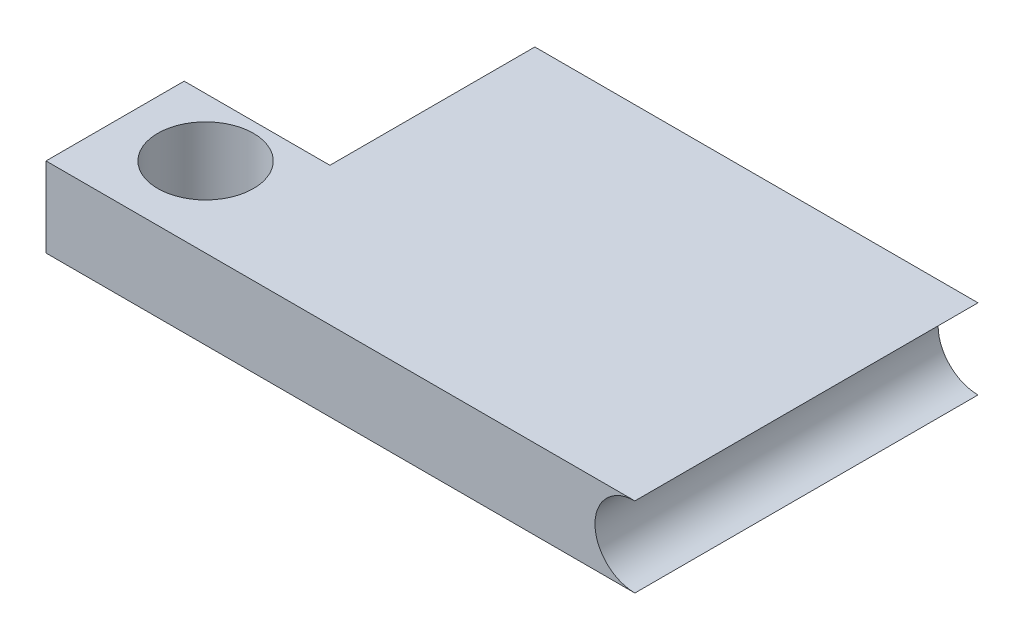
ISO-10303-21;
HEADER;
FILE_DESCRIPTION(('STEP AP214'),'2;1');
FILE_NAME('part.step','',(''),(''),'','','');
FILE_SCHEMA(('AUTOMOTIVE_DESIGN { 1 0 10303 214 1 1 1 1 }'));
ENDSEC;
DATA;
#1=APPLICATION_CONTEXT('core data for automotive mechanical design processes');
#2=APPLICATION_PROTOCOL_DEFINITION('international standard','automotive_design',2000,#1);
#3=PRODUCT_CONTEXT('',#1,'mechanical');
#4=PRODUCT('Part','Part','',(#3));
#5=PRODUCT_RELATED_PRODUCT_CATEGORY('part','',(#4));
#6=PRODUCT_DEFINITION_FORMATION('','',#4);
#7=PRODUCT_DEFINITION_CONTEXT('part definition',#1,'design');
#8=PRODUCT_DEFINITION('design','',#6,#7);
#9=PRODUCT_DEFINITION_SHAPE('','',#8);
#10=(LENGTH_UNIT() NAMED_UNIT(*) SI_UNIT(.MILLI.,.METRE.));
#11=(NAMED_UNIT(*) PLANE_ANGLE_UNIT() SI_UNIT($,.RADIAN.));
#12=(NAMED_UNIT(*) SI_UNIT($,.STERADIAN.) SOLID_ANGLE_UNIT());
#13=UNCERTAINTY_MEASURE_WITH_UNIT(LENGTH_MEASURE(1.E-05),#10,'distance_accuracy_value','');
#14=(GEOMETRIC_REPRESENTATION_CONTEXT(3) GLOBAL_UNCERTAINTY_ASSIGNED_CONTEXT((#13)) GLOBAL_UNIT_ASSIGNED_CONTEXT((#10,
#11,#12)) REPRESENTATION_CONTEXT('',''));
#15=CARTESIAN_POINT('',(0.,0.,0.));
#16=DIRECTION('',(0.,0.,1.));
#17=DIRECTION('',(1.,0.,0.));
#18=AXIS2_PLACEMENT_3D('',#15,#16,#17);
#19=CARTESIAN_POINT('',(0.,150.,644.999999999999));
#20=DIRECTION('',(1.,0.,0.));
#21=DIRECTION('',(0.,0.,-1.));
#22=AXIS2_PLACEMENT_3D('',#19,#20,#21);
#23=PLANE('',#22);
#24=DIRECTION('',(0.,0.,-1.));
#25=VECTOR('',#24,1.);
#26=CARTESIAN_POINT('',(0.,150.,644.999999999999));
#27=LINE('',#26,#25);
#28=CARTESIAN_POINT('',(0.,150.,644.999999999999));
#29=VERTEX_POINT('',#28);
#30=CARTESIAN_POINT('',(0.,150.,385.258703224895));
#31=VERTEX_POINT('',#30);
#32=EDGE_CURVE('E65',#29,#31,#27,.T.);
#33=ORIENTED_EDGE('',*,*,#32,.T.);
#34=DIRECTION('',(0.,-1.,0.));
#35=VECTOR('',#34,1.);
#36=CARTESIAN_POINT('',(0.,150.,385.258703224895));
#37=LINE('',#36,#35);
#38=CARTESIAN_POINT('',(0.,0.,385.258703224895));
#39=VERTEX_POINT('',#38);
#40=EDGE_CURVE('E85',#31,#39,#37,.T.);
#41=ORIENTED_EDGE('',*,*,#40,.T.);
#42=DIRECTION('',(0.,0.,-1.));
#43=VECTOR('',#42,1.);
#44=CARTESIAN_POINT('',(0.,0.,644.999999999999));
#45=LINE('',#44,#43);
#46=CARTESIAN_POINT('',(0.,0.,644.999999999999));
#47=VERTEX_POINT('',#46);
#48=EDGE_CURVE('E11',#47,#39,#45,.T.);
#49=ORIENTED_EDGE('',*,*,#48,.F.);
#50=DIRECTION('',(0.,-1.,0.));
#51=VECTOR('',#50,1.);
#52=CARTESIAN_POINT('',(0.,150.,644.999999999999));
#53=LINE('',#52,#51);
#54=EDGE_CURVE('E117',#29,#47,#53,.T.);
#55=ORIENTED_EDGE('',*,*,#54,.F.);
#56=EDGE_LOOP('',(#33,#41,#49,#55));
#57=FACE_BOUND('',#56,.T.);
#58=ADVANCED_FACE('F42',(#57),#23,.F.);
#59=CARTESIAN_POINT('',(0.,0.,644.999999999999));
#60=DIRECTION('',(0.,1.,0.));
#61=DIRECTION('',(0.,0.,1.));
#62=AXIS2_PLACEMENT_3D('',#59,#60,#61);
#63=PLANE('',#62);
#64=CARTESIAN_POINT('',(150.,0.,494.999999999999));
#65=DIRECTION('',(0.,-1.,0.));
#66=DIRECTION('',(0.,0.,-1.));
#67=AXIS2_PLACEMENT_3D('',#64,#65,#66);
#68=CIRCLE('',#67,90.);
#69=CARTESIAN_POINT('',(150.,0.,404.999999999999));
#70=VERTEX_POINT('',#69);
#71=EDGE_CURVE('E106',#70,#70,#68,.T.);
#72=ORIENTED_EDGE('',*,*,#71,.F.);
#73=EDGE_LOOP('',(#72));
#74=FACE_BOUND('',#73,.T.);
#75=ORIENTED_EDGE('',*,*,#48,.T.);
#76=DIRECTION('',(-1.,0.,0.));
#77=VECTOR('',#76,1.);
#78=CARTESIAN_POINT('',(0.,0.,385.258703224895));
#79=LINE('',#78,#77);
#80=CARTESIAN_POINT('',(273.936328983051,0.,385.258703224895));
#81=VERTEX_POINT('',#80);
#82=EDGE_CURVE('E96',#81,#39,#79,.T.);
#83=ORIENTED_EDGE('',*,*,#82,.F.);
#84=DIRECTION('',(0.,0.,1.));
#85=VECTOR('',#84,1.);
#86=CARTESIAN_POINT('',(273.936328983051,0.,0.));
#87=LINE('',#86,#85);
#88=CARTESIAN_POINT('',(273.936328983051,0.,0.));
#89=VERTEX_POINT('',#88);
#90=EDGE_CURVE('E102',#89,#81,#87,.T.);
#91=ORIENTED_EDGE('',*,*,#90,.F.);
#92=DIRECTION('',(1.,0.,0.));
#93=VECTOR('',#92,1.);
#94=CARTESIAN_POINT('',(0.,0.,0.));
#95=LINE('',#94,#93);
#96=CARTESIAN_POINT('',(1106.97250468037,0.,0.));
#97=VERTEX_POINT('',#96);
#98=EDGE_CURVE('E124',#89,#97,#95,.T.);
#99=ORIENTED_EDGE('',*,*,#98,.T.);
#100=DIRECTION('',(0.,0.,-1.));
#101=VECTOR('',#100,1.);
#102=CARTESIAN_POINT('',(1106.97250468037,0.,644.999999999999));
#103=LINE('',#102,#101);
#104=CARTESIAN_POINT('',(1106.97250468037,0.,644.999999999999));
#105=VERTEX_POINT('',#104);
#106=EDGE_CURVE('E49',#105,#97,#103,.T.);
#107=ORIENTED_EDGE('',*,*,#106,.F.);
#108=DIRECTION('',(1.,0.,0.));
#109=VECTOR('',#108,1.);
#110=CARTESIAN_POINT('',(0.,0.,644.999999999999));
#111=LINE('',#110,#109);
#112=EDGE_CURVE('E110',#47,#105,#111,.T.);
#113=ORIENTED_EDGE('',*,*,#112,.F.);
#114=EDGE_LOOP('',(#75,#83,#91,#99,#107,#113));
#115=FACE_BOUND('',#114,.T.);
#116=ADVANCED_FACE('F108',(#74,#115),#63,.F.);
#117=CARTESIAN_POINT('',(0.,150.,644.999999999999));
#118=DIRECTION('',(0.,1.,0.));
#119=DIRECTION('',(0.,0.,1.));
#120=AXIS2_PLACEMENT_3D('',#117,#118,#119);
#121=PLANE('',#120);
#122=DIRECTION('',(-1.,0.,0.));
#123=VECTOR('',#122,1.);
#124=CARTESIAN_POINT('',(0.,150.,385.258703224895));
#125=LINE('',#124,#123);
#126=CARTESIAN_POINT('',(273.936328983051,150.,385.258703224895));
#127=VERTEX_POINT('',#126);
#128=EDGE_CURVE('E148',#127,#31,#125,.T.);
#129=ORIENTED_EDGE('',*,*,#128,.T.);
#130=ORIENTED_EDGE('',*,*,#32,.F.);
#131=DIRECTION('',(1.,0.,0.));
#132=VECTOR('',#131,1.);
#133=CARTESIAN_POINT('',(0.,150.,644.999999999999));
#134=LINE('',#133,#132);
#135=CARTESIAN_POINT('',(1106.97250468037,150.,644.999999999999));
#136=VERTEX_POINT('',#135);
#137=EDGE_CURVE('E116',#29,#136,#134,.T.);
#138=ORIENTED_EDGE('',*,*,#137,.T.);
#139=DIRECTION('',(0.,0.,-1.));
#140=VECTOR('',#139,1.);
#141=CARTESIAN_POINT('',(1106.97250468037,150.,644.999999999999));
#142=LINE('',#141,#140);
#143=CARTESIAN_POINT('',(1106.97250468037,150.,0.));
#144=VERTEX_POINT('',#143);
#145=EDGE_CURVE('E133',#136,#144,#142,.T.);
#146=ORIENTED_EDGE('',*,*,#145,.T.);
#147=DIRECTION('',(1.,0.,0.));
#148=VECTOR('',#147,1.);
#149=CARTESIAN_POINT('',(0.,150.,0.));
#150=LINE('',#149,#148);
#151=CARTESIAN_POINT('',(273.936328983051,150.,0.));
#152=VERTEX_POINT('',#151);
#153=EDGE_CURVE('E121',#152,#144,#150,.T.);
#154=ORIENTED_EDGE('',*,*,#153,.F.);
#155=DIRECTION('',(0.,0.,1.));
#156=VECTOR('',#155,1.);
#157=CARTESIAN_POINT('',(273.936328983051,150.,0.));
#158=LINE('',#157,#156);
#159=EDGE_CURVE('E56',#152,#127,#158,.T.);
#160=ORIENTED_EDGE('',*,*,#159,.T.);
#161=EDGE_LOOP('',(#129,#130,#138,#146,#154,#160));
#162=FACE_BOUND('',#161,.T.);
#163=CARTESIAN_POINT('',(150.,150.,494.999999999999));
#164=DIRECTION('',(0.,-1.,0.));
#165=DIRECTION('',(0.,0.,-1.));
#166=AXIS2_PLACEMENT_3D('',#163,#164,#165);
#167=CIRCLE('',#166,90.);
#168=CARTESIAN_POINT('',(150.,150.,404.999999999999));
#169=VERTEX_POINT('',#168);
#170=EDGE_CURVE('E130',#169,#169,#167,.T.);
#171=ORIENTED_EDGE('',*,*,#170,.T.);
#172=EDGE_LOOP('',(#171));
#173=FACE_BOUND('',#172,.T.);
#174=ADVANCED_FACE('F137',(#162,#173),#121,.T.);
#175=CARTESIAN_POINT('',(0.,0.,644.999999999999));
#176=DIRECTION('',(0.,0.,1.));
#177=DIRECTION('',(1.,0.,0.));
#178=AXIS2_PLACEMENT_3D('',#175,#176,#177);
#179=PLANE('',#178);
#180=CARTESIAN_POINT('',(1106.97250468037,75.,644.999999999999));
#181=DIRECTION('',(0.,0.,1.));
#182=DIRECTION('',(-1.,0.,0.));
#183=AXIS2_PLACEMENT_3D('',#180,#181,#182);
#184=CIRCLE('',#183,75.);
#185=EDGE_CURVE('E142',#136,#105,#184,.T.);
#186=ORIENTED_EDGE('',*,*,#185,.F.);
#187=ORIENTED_EDGE('',*,*,#137,.F.);
#188=ORIENTED_EDGE('',*,*,#54,.T.);
#189=ORIENTED_EDGE('',*,*,#112,.T.);
#190=EDGE_LOOP('',(#186,#187,#188,#189));
#191=FACE_BOUND('',#190,.T.);
#192=ADVANCED_FACE('F120',(#191),#179,.T.);
#193=CARTESIAN_POINT('',(0.,0.,0.));
#194=DIRECTION('',(0.,0.,1.));
#195=DIRECTION('',(1.,0.,0.));
#196=AXIS2_PLACEMENT_3D('',#193,#194,#195);
#197=PLANE('',#196);
#198=ORIENTED_EDGE('',*,*,#153,.T.);
#199=CARTESIAN_POINT('',(1106.97250468037,75.,0.));
#200=DIRECTION('',(0.,0.,1.));
#201=DIRECTION('',(-1.,0.,0.));
#202=AXIS2_PLACEMENT_3D('',#199,#200,#201);
#203=CIRCLE('',#202,75.);
#204=EDGE_CURVE('E143',#144,#97,#203,.T.);
#205=ORIENTED_EDGE('',*,*,#204,.T.);
#206=ORIENTED_EDGE('',*,*,#98,.F.);
#207=DIRECTION('',(0.,-1.,0.));
#208=VECTOR('',#207,1.);
#209=CARTESIAN_POINT('',(273.936328983051,150.,0.));
#210=LINE('',#209,#208);
#211=EDGE_CURVE('E150',#152,#89,#210,.T.);
#212=ORIENTED_EDGE('',*,*,#211,.F.);
#213=EDGE_LOOP('',(#198,#205,#206,#212));
#214=FACE_BOUND('',#213,.T.);
#215=ADVANCED_FACE('F168',(#214),#197,.F.);
#216=CARTESIAN_POINT('',(150.,150.,494.999999999999));
#217=DIRECTION('',(0.,-1.,0.));
#218=DIRECTION('',(0.,0.,-1.));
#219=AXIS2_PLACEMENT_3D('',#216,#217,#218);
#220=CYLINDRICAL_SURFACE('',#219,90.);
#221=ORIENTED_EDGE('',*,*,#170,.F.);
#222=EDGE_LOOP('',(#221));
#223=FACE_BOUND('',#222,.T.);
#224=ORIENTED_EDGE('',*,*,#71,.T.);
#225=EDGE_LOOP('',(#224));
#226=FACE_BOUND('',#225,.T.);
#227=ADVANCED_FACE('F158',(#223,#226),#220,.F.);
#228=CARTESIAN_POINT('',(0.,150.,385.258703224895));
#229=DIRECTION('',(0.,0.,1.));
#230=DIRECTION('',(1.,0.,0.));
#231=AXIS2_PLACEMENT_3D('',#228,#229,#230);
#232=PLANE('',#231);
#233=ORIENTED_EDGE('',*,*,#82,.T.);
#234=ORIENTED_EDGE('',*,*,#40,.F.);
#235=ORIENTED_EDGE('',*,*,#128,.F.);
#236=DIRECTION('',(0.,-1.,0.));
#237=VECTOR('',#236,1.);
#238=CARTESIAN_POINT('',(273.936328983051,150.,385.258703224895));
#239=LINE('',#238,#237);
#240=EDGE_CURVE('E98',#127,#81,#239,.T.);
#241=ORIENTED_EDGE('',*,*,#240,.T.);
#242=EDGE_LOOP('',(#233,#234,#235,#241));
#243=FACE_BOUND('',#242,.T.);
#244=ADVANCED_FACE('F97',(#243),#232,.F.);
#245=CARTESIAN_POINT('',(273.936328983051,150.,0.));
#246=DIRECTION('',(1.,0.,0.));
#247=DIRECTION('',(0.,0.,-1.));
#248=AXIS2_PLACEMENT_3D('',#245,#246,#247);
#249=PLANE('',#248);
#250=ORIENTED_EDGE('',*,*,#90,.T.);
#251=ORIENTED_EDGE('',*,*,#240,.F.);
#252=ORIENTED_EDGE('',*,*,#159,.F.);
#253=ORIENTED_EDGE('',*,*,#211,.T.);
#254=EDGE_LOOP('',(#250,#251,#252,#253));
#255=FACE_BOUND('',#254,.T.);
#256=ADVANCED_FACE('F177',(#255),#249,.F.);
#257=CARTESIAN_POINT('',(1106.97250468037,75.,0.));
#258=DIRECTION('',(0.,0.,1.));
#259=DIRECTION('',(1.,0.,0.));
#260=AXIS2_PLACEMENT_3D('',#257,#258,#259);
#261=CYLINDRICAL_SURFACE('',#260,75.);
#262=ORIENTED_EDGE('',*,*,#185,.T.);
#263=ORIENTED_EDGE('',*,*,#106,.T.);
#264=ORIENTED_EDGE('',*,*,#204,.F.);
#265=ORIENTED_EDGE('',*,*,#145,.F.);
#266=EDGE_LOOP('',(#262,#263,#264,#265));
#267=FACE_BOUND('',#266,.T.);
#268=ADVANCED_FACE('F141',(#267),#261,.F.);
#269=CLOSED_SHELL('',(#58,#116,#174,#192,#215,#227,#244,#256,#268));
#270=MANIFOLD_SOLID_BREP('B2',#269);
#271=ADVANCED_BREP_SHAPE_REPRESENTATION('',(#18,#270),#14);
#272=SHAPE_DEFINITION_REPRESENTATION(#9,#271);
ENDSEC;
END-ISO-10303-21;
